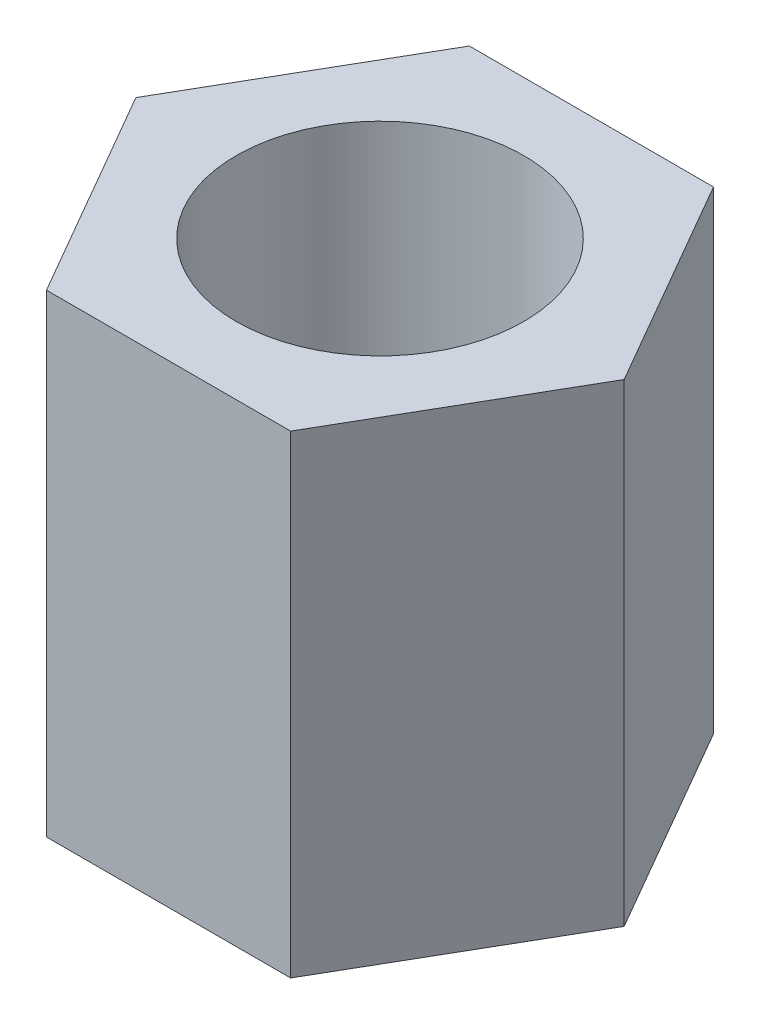
ISO-10303-21;
HEADER;
FILE_DESCRIPTION(('STEP AP214'),'2;1');
FILE_NAME('part.step','',(''),(''),'','','');
FILE_SCHEMA(('AUTOMOTIVE_DESIGN { 1 0 10303 214 1 1 1 1 }'));
ENDSEC;
DATA;
#1=APPLICATION_CONTEXT('core data for automotive mechanical design processes');
#2=APPLICATION_PROTOCOL_DEFINITION('international standard','automotive_design',2000,#1);
#3=PRODUCT_CONTEXT('',#1,'mechanical');
#4=PRODUCT('Part','Part','',(#3));
#5=PRODUCT_RELATED_PRODUCT_CATEGORY('part','',(#4));
#6=PRODUCT_DEFINITION_FORMATION('','',#4);
#7=PRODUCT_DEFINITION_CONTEXT('part definition',#1,'design');
#8=PRODUCT_DEFINITION('design','',#6,#7);
#9=PRODUCT_DEFINITION_SHAPE('','',#8);
#10=(LENGTH_UNIT() NAMED_UNIT(*) SI_UNIT(.MILLI.,.METRE.));
#11=(NAMED_UNIT(*) PLANE_ANGLE_UNIT() SI_UNIT($,.RADIAN.));
#12=(NAMED_UNIT(*) SI_UNIT($,.STERADIAN.) SOLID_ANGLE_UNIT());
#13=UNCERTAINTY_MEASURE_WITH_UNIT(LENGTH_MEASURE(1.E-05),#10,'distance_accuracy_value','');
#14=(GEOMETRIC_REPRESENTATION_CONTEXT(3) GLOBAL_UNCERTAINTY_ASSIGNED_CONTEXT((#13)) GLOBAL_UNIT_ASSIGNED_CONTEXT((#10,
#11,#12)) REPRESENTATION_CONTEXT('',''));
#15=CARTESIAN_POINT('',(0.,0.,0.));
#16=DIRECTION('',(0.,0.,1.));
#17=DIRECTION('',(1.,0.,0.));
#18=AXIS2_PLACEMENT_3D('',#15,#16,#17);
#19=CARTESIAN_POINT('',(0.,5.6,0.));
#20=DIRECTION('',(0.,1.,0.));
#21=DIRECTION('',(0.,0.,1.));
#22=AXIS2_PLACEMENT_3D('',#19,#20,#21);
#23=PLANE('',#22);
#24=DIRECTION('',(0.5,0.,-0.866025403784439));
#25=VECTOR('',#24,1.);
#26=CARTESIAN_POINT('',(1.44337567297407,5.6,2.5));
#27=LINE('',#26,#25);
#28=CARTESIAN_POINT('',(1.44337567297407,5.6,2.5));
#29=VERTEX_POINT('',#28);
#30=CARTESIAN_POINT('',(2.88675134594813,5.6,0.));
#31=VERTEX_POINT('',#30);
#32=EDGE_CURVE('E130',#29,#31,#27,.T.);
#33=ORIENTED_EDGE('',*,*,#32,.T.);
#34=DIRECTION('',(-0.5,0.,-0.866025403784438));
#35=VECTOR('',#34,1.);
#36=CARTESIAN_POINT('',(2.88675134594813,5.6,0.));
#37=LINE('',#36,#35);
#38=CARTESIAN_POINT('',(1.44337567297406,5.6,-2.5));
#39=VERTEX_POINT('',#38);
#40=EDGE_CURVE('E88',#31,#39,#37,.T.);
#41=ORIENTED_EDGE('',*,*,#40,.T.);
#42=DIRECTION('',(-1.,0.,0.));
#43=VECTOR('',#42,1.);
#44=CARTESIAN_POINT('',(1.44337567297406,5.6,-2.5));
#45=LINE('',#44,#43);
#46=CARTESIAN_POINT('',(-1.44337567297406,5.6,-2.5));
#47=VERTEX_POINT('',#46);
#48=EDGE_CURVE('E101',#39,#47,#45,.T.);
#49=ORIENTED_EDGE('',*,*,#48,.T.);
#50=DIRECTION('',(-0.5,0.,0.866025403784439));
#51=VECTOR('',#50,1.);
#52=CARTESIAN_POINT('',(-1.44337567297406,5.6,-2.5));
#53=LINE('',#52,#51);
#54=CARTESIAN_POINT('',(-2.88675134594813,5.6,0.));
#55=VERTEX_POINT('',#54);
#56=EDGE_CURVE('E95',#47,#55,#53,.T.);
#57=ORIENTED_EDGE('',*,*,#56,.T.);
#58=DIRECTION('',(0.5,0.,0.866025403784438));
#59=VECTOR('',#58,1.);
#60=CARTESIAN_POINT('',(-2.88675134594813,5.6,0.));
#61=LINE('',#60,#59);
#62=CARTESIAN_POINT('',(-1.44337567297406,5.6,2.5));
#63=VERTEX_POINT('',#62);
#64=EDGE_CURVE('E99',#55,#63,#61,.T.);
#65=ORIENTED_EDGE('',*,*,#64,.T.);
#66=DIRECTION('',(1.,0.,0.));
#67=VECTOR('',#66,1.);
#68=CARTESIAN_POINT('',(-1.44337567297406,5.6,2.5));
#69=LINE('',#68,#67);
#70=EDGE_CURVE('E51',#63,#29,#69,.T.);
#71=ORIENTED_EDGE('',*,*,#70,.T.);
#72=EDGE_LOOP('',(#33,#41,#49,#57,#65,#71));
#73=FACE_BOUND('',#72,.T.);
#74=CARTESIAN_POINT('',(0.,5.6,0.));
#75=DIRECTION('',(0.,1.,0.));
#76=DIRECTION('',(0.,0.,1.));
#77=AXIS2_PLACEMENT_3D('',#74,#75,#76);
#78=CIRCLE('',#77,1.7);
#79=CARTESIAN_POINT('',(0.,5.6,1.7));
#80=VERTEX_POINT('',#79);
#81=EDGE_CURVE('E123',#80,#80,#78,.T.);
#82=ORIENTED_EDGE('',*,*,#81,.F.);
#83=EDGE_LOOP('',(#82));
#84=FACE_BOUND('',#83,.T.);
#85=ADVANCED_FACE('F34',(#73,#84),#23,.T.);
#86=CARTESIAN_POINT('',(0.,0.,0.));
#87=DIRECTION('',(0.,1.,0.));
#88=DIRECTION('',(0.,0.,1.));
#89=AXIS2_PLACEMENT_3D('',#86,#87,#88);
#90=PLANE('',#89);
#91=DIRECTION('',(0.5,0.,-0.866025403784439));
#92=VECTOR('',#91,1.);
#93=CARTESIAN_POINT('',(1.44337567297407,0.,2.5));
#94=LINE('',#93,#92);
#95=CARTESIAN_POINT('',(1.44337567297407,0.,2.5));
#96=VERTEX_POINT('',#95);
#97=CARTESIAN_POINT('',(2.88675134594813,0.,0.));
#98=VERTEX_POINT('',#97);
#99=EDGE_CURVE('E119',#96,#98,#94,.T.);
#100=ORIENTED_EDGE('',*,*,#99,.F.);
#101=DIRECTION('',(1.,0.,0.));
#102=VECTOR('',#101,1.);
#103=CARTESIAN_POINT('',(-1.44337567297406,0.,2.5));
#104=LINE('',#103,#102);
#105=CARTESIAN_POINT('',(-1.44337567297406,0.,2.5));
#106=VERTEX_POINT('',#105);
#107=EDGE_CURVE('E80',#106,#96,#104,.T.);
#108=ORIENTED_EDGE('',*,*,#107,.F.);
#109=DIRECTION('',(0.5,0.,0.866025403784438));
#110=VECTOR('',#109,1.);
#111=CARTESIAN_POINT('',(-2.88675134594813,0.,0.));
#112=LINE('',#111,#110);
#113=CARTESIAN_POINT('',(-2.88675134594813,0.,0.));
#114=VERTEX_POINT('',#113);
#115=EDGE_CURVE('E74',#114,#106,#112,.T.);
#116=ORIENTED_EDGE('',*,*,#115,.F.);
#117=DIRECTION('',(-0.5,0.,0.866025403784439));
#118=VECTOR('',#117,1.);
#119=CARTESIAN_POINT('',(-1.44337567297406,0.,-2.5));
#120=LINE('',#119,#118);
#121=CARTESIAN_POINT('',(-1.44337567297406,0.,-2.5));
#122=VERTEX_POINT('',#121);
#123=EDGE_CURVE('E109',#122,#114,#120,.T.);
#124=ORIENTED_EDGE('',*,*,#123,.F.);
#125=DIRECTION('',(-1.,0.,0.));
#126=VECTOR('',#125,1.);
#127=CARTESIAN_POINT('',(1.44337567297406,0.,-2.5));
#128=LINE('',#127,#126);
#129=CARTESIAN_POINT('',(1.44337567297406,0.,-2.5));
#130=VERTEX_POINT('',#129);
#131=EDGE_CURVE('E125',#130,#122,#128,.T.);
#132=ORIENTED_EDGE('',*,*,#131,.F.);
#133=DIRECTION('',(-0.5,0.,-0.866025403784438));
#134=VECTOR('',#133,1.);
#135=CARTESIAN_POINT('',(2.88675134594813,0.,0.));
#136=LINE('',#135,#134);
#137=EDGE_CURVE('E122',#98,#130,#136,.T.);
#138=ORIENTED_EDGE('',*,*,#137,.F.);
#139=EDGE_LOOP('',(#100,#108,#116,#124,#132,#138));
#140=FACE_BOUND('',#139,.T.);
#141=CARTESIAN_POINT('',(0.,0.,0.));
#142=DIRECTION('',(0.,1.,0.));
#143=DIRECTION('',(0.,0.,1.));
#144=AXIS2_PLACEMENT_3D('',#141,#142,#143);
#145=CIRCLE('',#144,1.7);
#146=CARTESIAN_POINT('',(0.,0.,1.7));
#147=VERTEX_POINT('',#146);
#148=EDGE_CURVE('E223',#147,#147,#145,.T.);
#149=ORIENTED_EDGE('',*,*,#148,.T.);
#150=EDGE_LOOP('',(#149));
#151=FACE_BOUND('',#150,.T.);
#152=ADVANCED_FACE('F139',(#140,#151),#90,.F.);
#153=CARTESIAN_POINT('',(1.44337567297407,5.6,2.5));
#154=DIRECTION('',(-0.866025403784439,0.,-0.5));
#155=DIRECTION('',(-0.5,0.,0.866025403784439));
#156=AXIS2_PLACEMENT_3D('',#153,#154,#155);
#157=PLANE('',#156);
#158=ORIENTED_EDGE('',*,*,#99,.T.);
#159=DIRECTION('',(0.,-1.,0.));
#160=VECTOR('',#159,1.);
#161=CARTESIAN_POINT('',(2.88675134594813,5.6,0.));
#162=LINE('',#161,#160);
#163=EDGE_CURVE('E11',#31,#98,#162,.T.);
#164=ORIENTED_EDGE('',*,*,#163,.F.);
#165=ORIENTED_EDGE('',*,*,#32,.F.);
#166=DIRECTION('',(0.,-1.,0.));
#167=VECTOR('',#166,1.);
#168=CARTESIAN_POINT('',(1.44337567297407,5.6,2.5));
#169=LINE('',#168,#167);
#170=EDGE_CURVE('E115',#29,#96,#169,.T.);
#171=ORIENTED_EDGE('',*,*,#170,.T.);
#172=EDGE_LOOP('',(#158,#164,#165,#171));
#173=FACE_BOUND('',#172,.T.);
#174=ADVANCED_FACE('F36',(#173),#157,.F.);
#175=CARTESIAN_POINT('',(2.88675134594813,5.6,0.));
#176=DIRECTION('',(-0.866025403784438,0.,0.5));
#177=DIRECTION('',(0.5,0.,0.866025403784439));
#178=AXIS2_PLACEMENT_3D('',#175,#176,#177);
#179=PLANE('',#178);
#180=ORIENTED_EDGE('',*,*,#137,.T.);
#181=DIRECTION('',(0.,-1.,0.));
#182=VECTOR('',#181,1.);
#183=CARTESIAN_POINT('',(1.44337567297406,5.6,-2.5));
#184=LINE('',#183,#182);
#185=EDGE_CURVE('E43',#39,#130,#184,.T.);
#186=ORIENTED_EDGE('',*,*,#185,.F.);
#187=ORIENTED_EDGE('',*,*,#40,.F.);
#188=ORIENTED_EDGE('',*,*,#163,.T.);
#189=EDGE_LOOP('',(#180,#186,#187,#188));
#190=FACE_BOUND('',#189,.T.);
#191=ADVANCED_FACE('F164',(#190),#179,.F.);
#192=CARTESIAN_POINT('',(1.44337567297406,5.6,-2.5));
#193=DIRECTION('',(0.,0.,1.));
#194=DIRECTION('',(1.,0.,0.));
#195=AXIS2_PLACEMENT_3D('',#192,#193,#194);
#196=PLANE('',#195);
#197=ORIENTED_EDGE('',*,*,#131,.T.);
#198=DIRECTION('',(0.,-1.,0.));
#199=VECTOR('',#198,1.);
#200=CARTESIAN_POINT('',(-1.44337567297406,5.6,-2.5));
#201=LINE('',#200,#199);
#202=EDGE_CURVE('E110',#47,#122,#201,.T.);
#203=ORIENTED_EDGE('',*,*,#202,.F.);
#204=ORIENTED_EDGE('',*,*,#48,.F.);
#205=ORIENTED_EDGE('',*,*,#185,.T.);
#206=EDGE_LOOP('',(#197,#203,#204,#205));
#207=FACE_BOUND('',#206,.T.);
#208=ADVANCED_FACE('F136',(#207),#196,.F.);
#209=CARTESIAN_POINT('',(-1.44337567297406,5.6,-2.5));
#210=DIRECTION('',(0.866025403784439,0.,0.5));
#211=DIRECTION('',(0.5,0.,-0.866025403784439));
#212=AXIS2_PLACEMENT_3D('',#209,#210,#211);
#213=PLANE('',#212);
#214=ORIENTED_EDGE('',*,*,#123,.T.);
#215=DIRECTION('',(0.,-1.,0.));
#216=VECTOR('',#215,1.);
#217=CARTESIAN_POINT('',(-2.88675134594813,5.6,0.));
#218=LINE('',#217,#216);
#219=EDGE_CURVE('E106',#55,#114,#218,.T.);
#220=ORIENTED_EDGE('',*,*,#219,.F.);
#221=ORIENTED_EDGE('',*,*,#56,.F.);
#222=ORIENTED_EDGE('',*,*,#202,.T.);
#223=EDGE_LOOP('',(#214,#220,#221,#222));
#224=FACE_BOUND('',#223,.T.);
#225=ADVANCED_FACE('F107',(#224),#213,.F.);
#226=CARTESIAN_POINT('',(-2.88675134594813,5.6,0.));
#227=DIRECTION('',(0.866025403784438,0.,-0.5));
#228=DIRECTION('',(-0.5,0.,-0.866025403784439));
#229=AXIS2_PLACEMENT_3D('',#226,#227,#228);
#230=PLANE('',#229);
#231=ORIENTED_EDGE('',*,*,#115,.T.);
#232=DIRECTION('',(0.,-1.,0.));
#233=VECTOR('',#232,1.);
#234=CARTESIAN_POINT('',(-1.44337567297406,5.6,2.5));
#235=LINE('',#234,#233);
#236=EDGE_CURVE('E111',#63,#106,#235,.T.);
#237=ORIENTED_EDGE('',*,*,#236,.F.);
#238=ORIENTED_EDGE('',*,*,#64,.F.);
#239=ORIENTED_EDGE('',*,*,#219,.T.);
#240=EDGE_LOOP('',(#231,#237,#238,#239));
#241=FACE_BOUND('',#240,.T.);
#242=ADVANCED_FACE('F113',(#241),#230,.F.);
#243=CARTESIAN_POINT('',(-1.44337567297406,5.6,2.5));
#244=DIRECTION('',(0.,0.,-1.));
#245=DIRECTION('',(-1.,0.,0.));
#246=AXIS2_PLACEMENT_3D('',#243,#244,#245);
#247=PLANE('',#246);
#248=ORIENTED_EDGE('',*,*,#107,.T.);
#249=ORIENTED_EDGE('',*,*,#170,.F.);
#250=ORIENTED_EDGE('',*,*,#70,.F.);
#251=ORIENTED_EDGE('',*,*,#236,.T.);
#252=EDGE_LOOP('',(#248,#249,#250,#251));
#253=FACE_BOUND('',#252,.T.);
#254=ADVANCED_FACE('F144',(#253),#247,.F.);
#255=CARTESIAN_POINT('',(0.,5.6,0.));
#256=DIRECTION('',(0.,-1.,0.));
#257=DIRECTION('',(0.,0.,-1.));
#258=AXIS2_PLACEMENT_3D('',#255,#256,#257);
#259=CYLINDRICAL_SURFACE('',#258,1.7);
#260=ORIENTED_EDGE('',*,*,#81,.T.);
#261=EDGE_LOOP('',(#260));
#262=FACE_BOUND('',#261,.T.);
#263=ORIENTED_EDGE('',*,*,#148,.F.);
#264=EDGE_LOOP('',(#263));
#265=FACE_BOUND('',#264,.T.);
#266=ADVANCED_FACE('F146',(#262,#265),#259,.F.);
#267=CLOSED_SHELL('',(#85,#152,#174,#191,#208,#225,#242,#254,#266));
#268=MANIFOLD_SOLID_BREP('B2',#267);
#269=ADVANCED_BREP_SHAPE_REPRESENTATION('',(#18,#268),#14);
#270=SHAPE_DEFINITION_REPRESENTATION(#9,#269);
ENDSEC;
END-ISO-10303-21;
